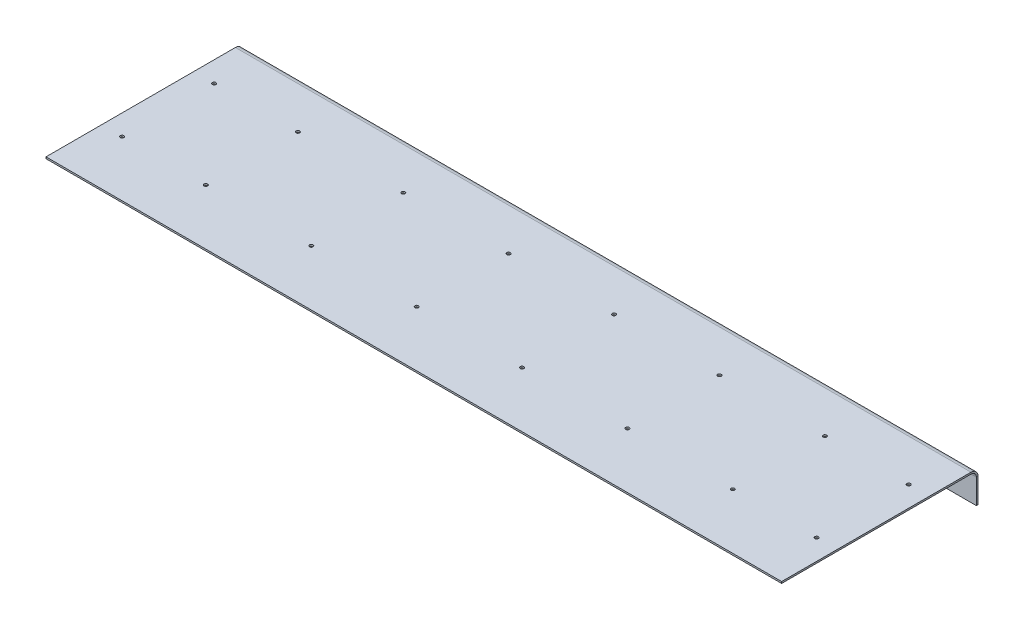
ISO-10303-21;
HEADER;
FILE_DESCRIPTION(('STEP AP214'),'2;1');
FILE_NAME('part.step','',(''),(''),'','','');
FILE_SCHEMA(('AUTOMOTIVE_DESIGN { 1 0 10303 214 1 1 1 1 }'));
ENDSEC;
DATA;
#1=APPLICATION_CONTEXT('core data for automotive mechanical design processes');
#2=APPLICATION_PROTOCOL_DEFINITION('international standard','automotive_design',2000,#1);
#3=PRODUCT_CONTEXT('',#1,'mechanical');
#4=PRODUCT('Part','Part','',(#3));
#5=PRODUCT_RELATED_PRODUCT_CATEGORY('part','',(#4));
#6=PRODUCT_DEFINITION_FORMATION('','',#4);
#7=PRODUCT_DEFINITION_CONTEXT('part definition',#1,'design');
#8=PRODUCT_DEFINITION('design','',#6,#7);
#9=PRODUCT_DEFINITION_SHAPE('','',#8);
#10=(LENGTH_UNIT() NAMED_UNIT(*) SI_UNIT(.MILLI.,.METRE.));
#11=(NAMED_UNIT(*) PLANE_ANGLE_UNIT() SI_UNIT($,.RADIAN.));
#12=(NAMED_UNIT(*) SI_UNIT($,.STERADIAN.) SOLID_ANGLE_UNIT());
#13=UNCERTAINTY_MEASURE_WITH_UNIT(LENGTH_MEASURE(1.E-05),#10,'distance_accuracy_value','');
#14=(GEOMETRIC_REPRESENTATION_CONTEXT(3) GLOBAL_UNCERTAINTY_ASSIGNED_CONTEXT((#13)) GLOBAL_UNIT_ASSIGNED_CONTEXT((#10,
#11,#12)) REPRESENTATION_CONTEXT('',''));
#15=CARTESIAN_POINT('',(0.,0.,0.));
#16=DIRECTION('',(0.,0.,1.));
#17=DIRECTION('',(1.,0.,0.));
#18=AXIS2_PLACEMENT_3D('',#15,#16,#17);
#19=CARTESIAN_POINT('',(686.2194092827,-3.175,-428.518987341772));
#20=DIRECTION('',(1.,0.,0.));
#21=DIRECTION('',(0.,0.,-1.));
#22=AXIS2_PLACEMENT_3D('',#19,#20,#21);
#23=PLANE('',#22);
#24=DIRECTION('',(0.,-1.,0.));
#25=VECTOR('',#24,1.);
#26=CARTESIAN_POINT('',(686.2194092827,6.825,-55.8789873417722));
#27=LINE('',#26,#25);
#28=CARTESIAN_POINT('',(686.2194092827,0.,-55.8789873417722));
#29=VERTEX_POINT('',#28);
#30=CARTESIAN_POINT('',(686.2194092827,-3.175,-55.8789873417722));
#31=VERTEX_POINT('',#30);
#32=EDGE_CURVE('E133',#29,#31,#27,.T.);
#33=ORIENTED_EDGE('',*,*,#32,.T.);
#34=DIRECTION('',(0.,0.,-1.));
#35=VECTOR('',#34,1.);
#36=CARTESIAN_POINT('',(686.2194092827,-3.175,-428.518987341772));
#37=LINE('',#36,#35);
#38=CARTESIAN_POINT('',(686.2194092827,-3.175,-415.343987341772));
#39=VERTEX_POINT('',#38);
#40=EDGE_CURVE('E13',#31,#39,#37,.T.);
#41=ORIENTED_EDGE('',*,*,#40,.T.);
#42=DIRECTION('',(0.,1.,0.));
#43=VECTOR('',#42,1.);
#44=CARTESIAN_POINT('',(686.2194092827,-3.175,-415.343987341772));
#45=LINE('',#44,#43);
#46=CARTESIAN_POINT('',(686.2194092827,0.,-415.343987341772));
#47=VERTEX_POINT('',#46);
#48=EDGE_CURVE('E248',#39,#47,#45,.T.);
#49=ORIENTED_EDGE('',*,*,#48,.T.);
#50=DIRECTION('',(0.,0.,-1.));
#51=VECTOR('',#50,1.);
#52=CARTESIAN_POINT('',(686.2194092827,0.,-428.518987341772));
#53=LINE('',#52,#51);
#54=EDGE_CURVE('E64',#29,#47,#53,.T.);
#55=ORIENTED_EDGE('',*,*,#54,.F.);
#56=EDGE_LOOP('',(#33,#41,#49,#55));
#57=FACE_BOUND('',#56,.T.);
#58=ADVANCED_FACE('F60',(#57),#23,.T.);
#59=CARTESIAN_POINT('',(0.,-3.175,0.));
#60=DIRECTION('',(0.,1.,0.));
#61=DIRECTION('',(0.,0.,1.));
#62=AXIS2_PLACEMENT_3D('',#59,#60,#61);
#63=PLANE('',#62);
#64=CARTESIAN_POINT('',(647.219409282701,-3.175,-335.878987341764));
#65=DIRECTION('',(0.,-1.,0.));
#66=DIRECTION('',(0.,0.,-1.));
#67=AXIS2_PLACEMENT_3D('',#64,#65,#66);
#68=CIRCLE('',#67,3.3782);
#69=CARTESIAN_POINT('',(647.219409282701,-3.175,-339.257187341764));
#70=VERTEX_POINT('',#69);
#71=EDGE_CURVE('E151',#70,#70,#68,.T.);
#72=ORIENTED_EDGE('',*,*,#71,.F.);
#73=EDGE_LOOP('',(#72));
#74=FACE_BOUND('',#73,.T.);
#75=CARTESIAN_POINT('',(647.219409282701,-3.175,-161.278987341764));
#76=DIRECTION('',(0.,-1.,0.));
#77=DIRECTION('',(0.,0.,-1.));
#78=AXIS2_PLACEMENT_3D('',#75,#76,#77);
#79=CIRCLE('',#78,3.3782);
#80=CARTESIAN_POINT('',(647.219409282701,-3.175,-164.657187341764));
#81=VERTEX_POINT('',#80);
#82=EDGE_CURVE('E159',#81,#81,#79,.T.);
#83=ORIENTED_EDGE('',*,*,#82,.F.);
#84=EDGE_LOOP('',(#83));
#85=FACE_BOUND('',#84,.T.);
#86=CARTESIAN_POINT('',(-670.7805907173,-3.175,-335.878987341772));
#87=DIRECTION('',(0.,-1.,0.));
#88=DIRECTION('',(0.,0.,-1.));
#89=AXIS2_PLACEMENT_3D('',#86,#87,#88);
#90=CIRCLE('',#89,3.3782);
#91=CARTESIAN_POINT('',(-670.7805907173,-3.175,-339.257187341772));
#92=VERTEX_POINT('',#91);
#93=EDGE_CURVE('E167',#92,#92,#90,.T.);
#94=ORIENTED_EDGE('',*,*,#93,.F.);
#95=EDGE_LOOP('',(#94));
#96=FACE_BOUND('',#95,.T.);
#97=CARTESIAN_POINT('',(-670.7805907173,-3.175,-161.278987341772));
#98=DIRECTION('',(0.,-1.,0.));
#99=DIRECTION('',(0.,0.,-1.));
#100=AXIS2_PLACEMENT_3D('',#97,#98,#99);
#101=CIRCLE('',#100,3.3782);
#102=CARTESIAN_POINT('',(-670.7805907173,-3.175,-164.657187341772));
#103=VERTEX_POINT('',#102);
#104=EDGE_CURVE('E173',#103,#103,#101,.T.);
#105=ORIENTED_EDGE('',*,*,#104,.F.);
#106=EDGE_LOOP('',(#105));
#107=FACE_BOUND('',#106,.T.);
#108=CARTESIAN_POINT('',(488.2194092827,-3.175,-335.878987341765));
#109=DIRECTION('',(0.,-1.,0.));
#110=DIRECTION('',(0.,0.,-1.));
#111=AXIS2_PLACEMENT_3D('',#108,#109,#110);
#112=CIRCLE('',#111,3.3782);
#113=CARTESIAN_POINT('',(488.2194092827,-3.175,-339.257187341765));
#114=VERTEX_POINT('',#113);
#115=EDGE_CURVE('E179',#114,#114,#112,.T.);
#116=ORIENTED_EDGE('',*,*,#115,.F.);
#117=EDGE_LOOP('',(#116));
#118=FACE_BOUND('',#117,.T.);
#119=CARTESIAN_POINT('',(488.2194092827,-3.175,-161.278987341765));
#120=DIRECTION('',(0.,-1.,0.));
#121=DIRECTION('',(0.,0.,-1.));
#122=AXIS2_PLACEMENT_3D('',#119,#120,#121);
#123=CIRCLE('',#122,3.3782);
#124=CARTESIAN_POINT('',(488.2194092827,-3.175,-164.657187341765));
#125=VERTEX_POINT('',#124);
#126=EDGE_CURVE('E185',#125,#125,#123,.T.);
#127=ORIENTED_EDGE('',*,*,#126,.F.);
#128=EDGE_LOOP('',(#127));
#129=FACE_BOUND('',#128,.T.);
#130=CARTESIAN_POINT('',(288.2194092827,-3.175,-335.878987341767));
#131=DIRECTION('',(0.,-1.,0.));
#132=DIRECTION('',(0.,0.,-1.));
#133=AXIS2_PLACEMENT_3D('',#130,#131,#132);
#134=CIRCLE('',#133,3.3782);
#135=CARTESIAN_POINT('',(288.2194092827,-3.175,-339.257187341767));
#136=VERTEX_POINT('',#135);
#137=EDGE_CURVE('E191',#136,#136,#134,.T.);
#138=ORIENTED_EDGE('',*,*,#137,.F.);
#139=EDGE_LOOP('',(#138));
#140=FACE_BOUND('',#139,.T.);
#141=CARTESIAN_POINT('',(288.2194092827,-3.175,-161.278987341767));
#142=DIRECTION('',(0.,-1.,0.));
#143=DIRECTION('',(0.,0.,-1.));
#144=AXIS2_PLACEMENT_3D('',#141,#142,#143);
#145=CIRCLE('',#144,3.3782);
#146=CARTESIAN_POINT('',(288.2194092827,-3.175,-164.657187341767));
#147=VERTEX_POINT('',#146);
#148=EDGE_CURVE('E197',#147,#147,#145,.T.);
#149=ORIENTED_EDGE('',*,*,#148,.F.);
#150=EDGE_LOOP('',(#149));
#151=FACE_BOUND('',#150,.T.);
#152=CARTESIAN_POINT('',(88.2194092827006,-3.175,-335.878987341768));
#153=DIRECTION('',(0.,-1.,0.));
#154=DIRECTION('',(0.,0.,-1.));
#155=AXIS2_PLACEMENT_3D('',#152,#153,#154);
#156=CIRCLE('',#155,3.3782);
#157=CARTESIAN_POINT('',(88.2194092827006,-3.175,-339.257187341768));
#158=VERTEX_POINT('',#157);
#159=EDGE_CURVE('E203',#158,#158,#156,.T.);
#160=ORIENTED_EDGE('',*,*,#159,.F.);
#161=EDGE_LOOP('',(#160));
#162=FACE_BOUND('',#161,.T.);
#163=CARTESIAN_POINT('',(88.2194092827006,-3.175,-161.278987341768));
#164=DIRECTION('',(0.,-1.,0.));
#165=DIRECTION('',(0.,0.,-1.));
#166=AXIS2_PLACEMENT_3D('',#163,#164,#165);
#167=CIRCLE('',#166,3.3782);
#168=CARTESIAN_POINT('',(88.2194092827006,-3.175,-164.657187341768));
#169=VERTEX_POINT('',#168);
#170=EDGE_CURVE('E209',#169,#169,#167,.T.);
#171=ORIENTED_EDGE('',*,*,#170,.F.);
#172=EDGE_LOOP('',(#171));
#173=FACE_BOUND('',#172,.T.);
#174=CARTESIAN_POINT('',(-111.7805907173,-3.175,-335.87898734177));
#175=DIRECTION('',(0.,-1.,0.));
#176=DIRECTION('',(0.,0.,-1.));
#177=AXIS2_PLACEMENT_3D('',#174,#175,#176);
#178=CIRCLE('',#177,3.3782);
#179=CARTESIAN_POINT('',(-111.7805907173,-3.175,-339.25718734177));
#180=VERTEX_POINT('',#179);
#181=EDGE_CURVE('E215',#180,#180,#178,.T.);
#182=ORIENTED_EDGE('',*,*,#181,.F.);
#183=EDGE_LOOP('',(#182));
#184=FACE_BOUND('',#183,.T.);
#185=CARTESIAN_POINT('',(-111.7805907173,-3.175,-161.27898734177));
#186=DIRECTION('',(0.,-1.,0.));
#187=DIRECTION('',(0.,0.,-1.));
#188=AXIS2_PLACEMENT_3D('',#185,#186,#187);
#189=CIRCLE('',#188,3.3782);
#190=CARTESIAN_POINT('',(-111.7805907173,-3.175,-164.65718734177));
#191=VERTEX_POINT('',#190);
#192=EDGE_CURVE('E221',#191,#191,#189,.T.);
#193=ORIENTED_EDGE('',*,*,#192,.F.);
#194=EDGE_LOOP('',(#193));
#195=FACE_BOUND('',#194,.T.);
#196=CARTESIAN_POINT('',(-311.7805907173,-3.175,-335.878987341771));
#197=DIRECTION('',(0.,-1.,0.));
#198=DIRECTION('',(0.,0.,-1.));
#199=AXIS2_PLACEMENT_3D('',#196,#197,#198);
#200=CIRCLE('',#199,3.3782);
#201=CARTESIAN_POINT('',(-311.7805907173,-3.175,-339.257187341771));
#202=VERTEX_POINT('',#201);
#203=EDGE_CURVE('E227',#202,#202,#200,.T.);
#204=ORIENTED_EDGE('',*,*,#203,.F.);
#205=EDGE_LOOP('',(#204));
#206=FACE_BOUND('',#205,.T.);
#207=CARTESIAN_POINT('',(-311.7805907173,-3.175,-161.278987341771));
#208=DIRECTION('',(0.,-1.,0.));
#209=DIRECTION('',(0.,0.,-1.));
#210=AXIS2_PLACEMENT_3D('',#207,#208,#209);
#211=CIRCLE('',#210,3.3782);
#212=CARTESIAN_POINT('',(-311.7805907173,-3.175,-164.657187341771));
#213=VERTEX_POINT('',#212);
#214=EDGE_CURVE('E233',#213,#213,#211,.T.);
#215=ORIENTED_EDGE('',*,*,#214,.F.);
#216=EDGE_LOOP('',(#215));
#217=FACE_BOUND('',#216,.T.);
#218=CARTESIAN_POINT('',(-511.7805907173,-3.175,-335.878987341772));
#219=DIRECTION('',(0.,-1.,0.));
#220=DIRECTION('',(0.,0.,-1.));
#221=AXIS2_PLACEMENT_3D('',#218,#219,#220);
#222=CIRCLE('',#221,3.3782);
#223=CARTESIAN_POINT('',(-511.7805907173,-3.175,-339.257187341772));
#224=VERTEX_POINT('',#223);
#225=EDGE_CURVE('E239',#224,#224,#222,.T.);
#226=ORIENTED_EDGE('',*,*,#225,.F.);
#227=EDGE_LOOP('',(#226));
#228=FACE_BOUND('',#227,.T.);
#229=CARTESIAN_POINT('',(-511.7805907173,-3.175,-161.278987341772));
#230=DIRECTION('',(0.,-1.,0.));
#231=DIRECTION('',(0.,0.,-1.));
#232=AXIS2_PLACEMENT_3D('',#229,#230,#231);
#233=CIRCLE('',#232,3.3782);
#234=CARTESIAN_POINT('',(-511.7805907173,-3.175,-164.657187341772));
#235=VERTEX_POINT('',#234);
#236=EDGE_CURVE('E245',#235,#235,#233,.T.);
#237=ORIENTED_EDGE('',*,*,#236,.F.);
#238=EDGE_LOOP('',(#237));
#239=FACE_BOUND('',#238,.T.);
#240=ORIENTED_EDGE('',*,*,#40,.F.);
#241=DIRECTION('',(1.,0.,0.));
#242=VECTOR('',#241,1.);
#243=CARTESIAN_POINT('',(-709.7805907173,-3.175,-55.8789873417724));
#244=LINE('',#243,#242);
#245=CARTESIAN_POINT('',(-709.7805907173,-3.175,-55.8789873417724));
#246=VERTEX_POINT('',#245);
#247=EDGE_CURVE('E127',#246,#31,#244,.T.);
#248=ORIENTED_EDGE('',*,*,#247,.F.);
#249=DIRECTION('',(0.,0.,1.));
#250=VECTOR('',#249,1.);
#251=CARTESIAN_POINT('',(-709.7805907173,-3.175,-428.518987341772));
#252=LINE('',#251,#250);
#253=CARTESIAN_POINT('',(-709.7805907173,-3.175,-415.343987341772));
#254=VERTEX_POINT('',#253);
#255=EDGE_CURVE('E69',#254,#246,#252,.T.);
#256=ORIENTED_EDGE('',*,*,#255,.F.);
#257=DIRECTION('',(1.,0.,0.));
#258=VECTOR('',#257,1.);
#259=CARTESIAN_POINT('',(686.2194092827,-3.175,-415.343987341772));
#260=LINE('',#259,#258);
#261=EDGE_CURVE('E255',#39,#254,#260,.F.);
#262=ORIENTED_EDGE('',*,*,#261,.F.);
#263=EDGE_LOOP('',(#240,#248,#256,#262));
#264=FACE_BOUND('',#263,.T.);
#265=ADVANCED_FACE('F138',(#74,#85,#96,#107,#118,#129,#140,#151,#162,#173,#184,#195,#206,#217,
#228,#239,#264),#63,.F.);
#266=CARTESIAN_POINT('',(0.,0.,0.));
#267=DIRECTION('',(0.,1.,0.));
#268=DIRECTION('',(0.,0.,1.));
#269=AXIS2_PLACEMENT_3D('',#266,#267,#268);
#270=PLANE('',#269);
#271=DIRECTION('',(-1.,0.,0.));
#272=VECTOR('',#271,1.);
#273=CARTESIAN_POINT('',(0.,0.,-55.8789873417723));
#274=LINE('',#273,#272);
#275=CARTESIAN_POINT('',(-709.7805907173,0.,-55.8789873417725));
#276=VERTEX_POINT('',#275);
#277=EDGE_CURVE('E77',#29,#276,#274,.T.);
#278=ORIENTED_EDGE('',*,*,#277,.F.);
#279=ORIENTED_EDGE('',*,*,#54,.T.);
#280=DIRECTION('',(1.,0.,0.));
#281=VECTOR('',#280,1.);
#282=CARTESIAN_POINT('',(686.2194092827,0.,-415.343987341772));
#283=LINE('',#282,#281);
#284=CARTESIAN_POINT('',(-709.7805907173,0.,-415.343987341772));
#285=VERTEX_POINT('',#284);
#286=EDGE_CURVE('E264',#47,#285,#283,.F.);
#287=ORIENTED_EDGE('',*,*,#286,.T.);
#288=DIRECTION('',(0.,0.,1.));
#289=VECTOR('',#288,1.);
#290=CARTESIAN_POINT('',(-709.7805907173,0.,-428.518987341772));
#291=LINE('',#290,#289);
#292=EDGE_CURVE('E144',#285,#276,#291,.T.);
#293=ORIENTED_EDGE('',*,*,#292,.T.);
#294=EDGE_LOOP('',(#278,#279,#287,#293));
#295=FACE_BOUND('',#294,.T.);
#296=CARTESIAN_POINT('',(-511.7805907173,0.,-161.278987341772));
#297=DIRECTION('',(0.,-1.,0.));
#298=DIRECTION('',(0.,0.,-1.));
#299=AXIS2_PLACEMENT_3D('',#296,#297,#298);
#300=CIRCLE('',#299,3.3782);
#301=CARTESIAN_POINT('',(-511.7805907173,0.,-164.657187341772));
#302=VERTEX_POINT('',#301);
#303=EDGE_CURVE('E242',#302,#302,#300,.T.);
#304=ORIENTED_EDGE('',*,*,#303,.T.);
#305=EDGE_LOOP('',(#304));
#306=FACE_BOUND('',#305,.T.);
#307=CARTESIAN_POINT('',(-511.7805907173,0.,-335.878987341772));
#308=DIRECTION('',(0.,-1.,0.));
#309=DIRECTION('',(0.,0.,-1.));
#310=AXIS2_PLACEMENT_3D('',#307,#308,#309);
#311=CIRCLE('',#310,3.3782);
#312=CARTESIAN_POINT('',(-511.7805907173,0.,-339.257187341772));
#313=VERTEX_POINT('',#312);
#314=EDGE_CURVE('E236',#313,#313,#311,.T.);
#315=ORIENTED_EDGE('',*,*,#314,.T.);
#316=EDGE_LOOP('',(#315));
#317=FACE_BOUND('',#316,.T.);
#318=CARTESIAN_POINT('',(-311.7805907173,0.,-161.278987341771));
#319=DIRECTION('',(0.,-1.,0.));
#320=DIRECTION('',(0.,0.,-1.));
#321=AXIS2_PLACEMENT_3D('',#318,#319,#320);
#322=CIRCLE('',#321,3.3782);
#323=CARTESIAN_POINT('',(-311.7805907173,0.,-164.657187341771));
#324=VERTEX_POINT('',#323);
#325=EDGE_CURVE('E230',#324,#324,#322,.T.);
#326=ORIENTED_EDGE('',*,*,#325,.T.);
#327=EDGE_LOOP('',(#326));
#328=FACE_BOUND('',#327,.T.);
#329=CARTESIAN_POINT('',(-311.7805907173,0.,-335.878987341771));
#330=DIRECTION('',(0.,-1.,0.));
#331=DIRECTION('',(0.,0.,-1.));
#332=AXIS2_PLACEMENT_3D('',#329,#330,#331);
#333=CIRCLE('',#332,3.3782);
#334=CARTESIAN_POINT('',(-311.7805907173,0.,-339.257187341771));
#335=VERTEX_POINT('',#334);
#336=EDGE_CURVE('E224',#335,#335,#333,.T.);
#337=ORIENTED_EDGE('',*,*,#336,.T.);
#338=EDGE_LOOP('',(#337));
#339=FACE_BOUND('',#338,.T.);
#340=CARTESIAN_POINT('',(-111.7805907173,0.,-161.27898734177));
#341=DIRECTION('',(0.,-1.,0.));
#342=DIRECTION('',(0.,0.,-1.));
#343=AXIS2_PLACEMENT_3D('',#340,#341,#342);
#344=CIRCLE('',#343,3.3782);
#345=CARTESIAN_POINT('',(-111.7805907173,0.,-164.65718734177));
#346=VERTEX_POINT('',#345);
#347=EDGE_CURVE('E218',#346,#346,#344,.T.);
#348=ORIENTED_EDGE('',*,*,#347,.T.);
#349=EDGE_LOOP('',(#348));
#350=FACE_BOUND('',#349,.T.);
#351=CARTESIAN_POINT('',(-111.7805907173,0.,-335.87898734177));
#352=DIRECTION('',(0.,-1.,0.));
#353=DIRECTION('',(0.,0.,-1.));
#354=AXIS2_PLACEMENT_3D('',#351,#352,#353);
#355=CIRCLE('',#354,3.3782);
#356=CARTESIAN_POINT('',(-111.7805907173,0.,-339.25718734177));
#357=VERTEX_POINT('',#356);
#358=EDGE_CURVE('E212',#357,#357,#355,.T.);
#359=ORIENTED_EDGE('',*,*,#358,.T.);
#360=EDGE_LOOP('',(#359));
#361=FACE_BOUND('',#360,.T.);
#362=CARTESIAN_POINT('',(88.2194092827006,0.,-161.278987341768));
#363=DIRECTION('',(0.,-1.,0.));
#364=DIRECTION('',(0.,0.,-1.));
#365=AXIS2_PLACEMENT_3D('',#362,#363,#364);
#366=CIRCLE('',#365,3.3782);
#367=CARTESIAN_POINT('',(88.2194092827006,0.,-164.657187341768));
#368=VERTEX_POINT('',#367);
#369=EDGE_CURVE('E206',#368,#368,#366,.T.);
#370=ORIENTED_EDGE('',*,*,#369,.T.);
#371=EDGE_LOOP('',(#370));
#372=FACE_BOUND('',#371,.T.);
#373=CARTESIAN_POINT('',(88.2194092827006,0.,-335.878987341768));
#374=DIRECTION('',(0.,-1.,0.));
#375=DIRECTION('',(0.,0.,-1.));
#376=AXIS2_PLACEMENT_3D('',#373,#374,#375);
#377=CIRCLE('',#376,3.3782);
#378=CARTESIAN_POINT('',(88.2194092827006,0.,-339.257187341768));
#379=VERTEX_POINT('',#378);
#380=EDGE_CURVE('E200',#379,#379,#377,.T.);
#381=ORIENTED_EDGE('',*,*,#380,.T.);
#382=EDGE_LOOP('',(#381));
#383=FACE_BOUND('',#382,.T.);
#384=CARTESIAN_POINT('',(288.2194092827,0.,-161.278987341767));
#385=DIRECTION('',(0.,-1.,0.));
#386=DIRECTION('',(0.,0.,-1.));
#387=AXIS2_PLACEMENT_3D('',#384,#385,#386);
#388=CIRCLE('',#387,3.3782);
#389=CARTESIAN_POINT('',(288.2194092827,0.,-164.657187341767));
#390=VERTEX_POINT('',#389);
#391=EDGE_CURVE('E194',#390,#390,#388,.T.);
#392=ORIENTED_EDGE('',*,*,#391,.T.);
#393=EDGE_LOOP('',(#392));
#394=FACE_BOUND('',#393,.T.);
#395=CARTESIAN_POINT('',(288.2194092827,0.,-335.878987341767));
#396=DIRECTION('',(0.,-1.,0.));
#397=DIRECTION('',(0.,0.,-1.));
#398=AXIS2_PLACEMENT_3D('',#395,#396,#397);
#399=CIRCLE('',#398,3.3782);
#400=CARTESIAN_POINT('',(288.2194092827,0.,-339.257187341767));
#401=VERTEX_POINT('',#400);
#402=EDGE_CURVE('E188',#401,#401,#399,.T.);
#403=ORIENTED_EDGE('',*,*,#402,.T.);
#404=EDGE_LOOP('',(#403));
#405=FACE_BOUND('',#404,.T.);
#406=CARTESIAN_POINT('',(488.2194092827,0.,-161.278987341765));
#407=DIRECTION('',(0.,-1.,0.));
#408=DIRECTION('',(0.,0.,-1.));
#409=AXIS2_PLACEMENT_3D('',#406,#407,#408);
#410=CIRCLE('',#409,3.3782);
#411=CARTESIAN_POINT('',(488.2194092827,0.,-164.657187341765));
#412=VERTEX_POINT('',#411);
#413=EDGE_CURVE('E182',#412,#412,#410,.T.);
#414=ORIENTED_EDGE('',*,*,#413,.T.);
#415=EDGE_LOOP('',(#414));
#416=FACE_BOUND('',#415,.T.);
#417=CARTESIAN_POINT('',(488.2194092827,0.,-335.878987341765));
#418=DIRECTION('',(0.,-1.,0.));
#419=DIRECTION('',(0.,0.,-1.));
#420=AXIS2_PLACEMENT_3D('',#417,#418,#419);
#421=CIRCLE('',#420,3.3782);
#422=CARTESIAN_POINT('',(488.2194092827,0.,-339.257187341765));
#423=VERTEX_POINT('',#422);
#424=EDGE_CURVE('E176',#423,#423,#421,.T.);
#425=ORIENTED_EDGE('',*,*,#424,.T.);
#426=EDGE_LOOP('',(#425));
#427=FACE_BOUND('',#426,.T.);
#428=CARTESIAN_POINT('',(-670.7805907173,0.,-161.278987341772));
#429=DIRECTION('',(0.,-1.,0.));
#430=DIRECTION('',(0.,0.,-1.));
#431=AXIS2_PLACEMENT_3D('',#428,#429,#430);
#432=CIRCLE('',#431,3.3782);
#433=CARTESIAN_POINT('',(-670.7805907173,0.,-164.657187341772));
#434=VERTEX_POINT('',#433);
#435=EDGE_CURVE('E170',#434,#434,#432,.T.);
#436=ORIENTED_EDGE('',*,*,#435,.T.);
#437=EDGE_LOOP('',(#436));
#438=FACE_BOUND('',#437,.T.);
#439=CARTESIAN_POINT('',(-670.7805907173,0.,-335.878987341772));
#440=DIRECTION('',(0.,-1.,0.));
#441=DIRECTION('',(0.,0.,-1.));
#442=AXIS2_PLACEMENT_3D('',#439,#440,#441);
#443=CIRCLE('',#442,3.3782);
#444=CARTESIAN_POINT('',(-670.7805907173,0.,-339.257187341772));
#445=VERTEX_POINT('',#444);
#446=EDGE_CURVE('E164',#445,#445,#443,.T.);
#447=ORIENTED_EDGE('',*,*,#446,.T.);
#448=EDGE_LOOP('',(#447));
#449=FACE_BOUND('',#448,.T.);
#450=CARTESIAN_POINT('',(647.219409282701,0.,-161.278987341764));
#451=DIRECTION('',(0.,-1.,0.));
#452=DIRECTION('',(0.,0.,-1.));
#453=AXIS2_PLACEMENT_3D('',#450,#451,#452);
#454=CIRCLE('',#453,3.3782);
#455=CARTESIAN_POINT('',(647.219409282701,0.,-164.657187341764));
#456=VERTEX_POINT('',#455);
#457=EDGE_CURVE('E155',#456,#456,#454,.T.);
#458=ORIENTED_EDGE('',*,*,#457,.T.);
#459=EDGE_LOOP('',(#458));
#460=FACE_BOUND('',#459,.T.);
#461=CARTESIAN_POINT('',(647.219409282701,0.,-335.878987341764));
#462=DIRECTION('',(0.,-1.,0.));
#463=DIRECTION('',(0.,0.,-1.));
#464=AXIS2_PLACEMENT_3D('',#461,#462,#463);
#465=CIRCLE('',#464,3.3782);
#466=CARTESIAN_POINT('',(647.219409282701,0.,-339.257187341764));
#467=VERTEX_POINT('',#466);
#468=EDGE_CURVE('E146',#467,#467,#465,.T.);
#469=ORIENTED_EDGE('',*,*,#468,.T.);
#470=EDGE_LOOP('',(#469));
#471=FACE_BOUND('',#470,.T.);
#472=ADVANCED_FACE('F336',(#295,#306,#317,#328,#339,#350,#361,#372,#383,#394,#405,#416,#427,
#438,#449,#460,#471),#270,.T.);
#473=CARTESIAN_POINT('',(-709.7805907173,-3.175,-428.518987341772));
#474=DIRECTION('',(-1.,0.,0.));
#475=DIRECTION('',(0.,0.,1.));
#476=AXIS2_PLACEMENT_3D('',#473,#474,#475);
#477=PLANE('',#476);
#478=DIRECTION('',(0.,-1.,0.));
#479=VECTOR('',#478,1.);
#480=CARTESIAN_POINT('',(-709.7805907173,6.825,-55.8789873417724));
#481=LINE('',#480,#479);
#482=EDGE_CURVE('E124',#276,#246,#481,.T.);
#483=ORIENTED_EDGE('',*,*,#482,.F.);
#484=ORIENTED_EDGE('',*,*,#292,.F.);
#485=DIRECTION('',(0.,1.,0.));
#486=VECTOR('',#485,1.);
#487=CARTESIAN_POINT('',(-709.7805907173,-3.175,-415.343987341772));
#488=LINE('',#487,#486);
#489=EDGE_CURVE('E142',#254,#285,#488,.T.);
#490=ORIENTED_EDGE('',*,*,#489,.F.);
#491=ORIENTED_EDGE('',*,*,#255,.T.);
#492=EDGE_LOOP('',(#483,#484,#490,#491));
#493=FACE_BOUND('',#492,.T.);
#494=ADVANCED_FACE('F62',(#493),#477,.T.);
#495=CARTESIAN_POINT('',(647.219409282701,-3.175,-335.878987341764));
#496=DIRECTION('',(0.,-1.,0.));
#497=DIRECTION('',(0.,0.,-1.));
#498=AXIS2_PLACEMENT_3D('',#495,#496,#497);
#499=CYLINDRICAL_SURFACE('',#498,3.3782);
#500=ORIENTED_EDGE('',*,*,#468,.F.);
#501=EDGE_LOOP('',(#500));
#502=FACE_BOUND('',#501,.T.);
#503=ORIENTED_EDGE('',*,*,#71,.T.);
#504=EDGE_LOOP('',(#503));
#505=FACE_BOUND('',#504,.T.);
#506=ADVANCED_FACE('F391',(#502,#505),#499,.F.);
#507=CARTESIAN_POINT('',(647.219409282701,-3.175,-161.278987341764));
#508=DIRECTION('',(0.,-1.,0.));
#509=DIRECTION('',(0.,0.,-1.));
#510=AXIS2_PLACEMENT_3D('',#507,#508,#509);
#511=CYLINDRICAL_SURFACE('',#510,3.3782);
#512=ORIENTED_EDGE('',*,*,#457,.F.);
#513=EDGE_LOOP('',(#512));
#514=FACE_BOUND('',#513,.T.);
#515=ORIENTED_EDGE('',*,*,#82,.T.);
#516=EDGE_LOOP('',(#515));
#517=FACE_BOUND('',#516,.T.);
#518=ADVANCED_FACE('F394',(#514,#517),#511,.F.);
#519=CARTESIAN_POINT('',(-670.7805907173,-3.175,-335.878987341772));
#520=DIRECTION('',(0.,-1.,0.));
#521=DIRECTION('',(0.,0.,-1.));
#522=AXIS2_PLACEMENT_3D('',#519,#520,#521);
#523=CYLINDRICAL_SURFACE('',#522,3.3782);
#524=ORIENTED_EDGE('',*,*,#446,.F.);
#525=EDGE_LOOP('',(#524));
#526=FACE_BOUND('',#525,.T.);
#527=ORIENTED_EDGE('',*,*,#93,.T.);
#528=EDGE_LOOP('',(#527));
#529=FACE_BOUND('',#528,.T.);
#530=ADVANCED_FACE('F398',(#526,#529),#523,.F.);
#531=CARTESIAN_POINT('',(-670.7805907173,-3.175,-161.278987341772));
#532=DIRECTION('',(0.,-1.,0.));
#533=DIRECTION('',(0.,0.,-1.));
#534=AXIS2_PLACEMENT_3D('',#531,#532,#533);
#535=CYLINDRICAL_SURFACE('',#534,3.3782);
#536=ORIENTED_EDGE('',*,*,#435,.F.);
#537=EDGE_LOOP('',(#536));
#538=FACE_BOUND('',#537,.T.);
#539=ORIENTED_EDGE('',*,*,#104,.T.);
#540=EDGE_LOOP('',(#539));
#541=FACE_BOUND('',#540,.T.);
#542=ADVANCED_FACE('F402',(#538,#541),#535,.F.);
#543=CARTESIAN_POINT('',(488.2194092827,-3.175,-335.878987341765));
#544=DIRECTION('',(0.,-1.,0.));
#545=DIRECTION('',(0.,0.,-1.));
#546=AXIS2_PLACEMENT_3D('',#543,#544,#545);
#547=CYLINDRICAL_SURFACE('',#546,3.3782);
#548=ORIENTED_EDGE('',*,*,#424,.F.);
#549=EDGE_LOOP('',(#548));
#550=FACE_BOUND('',#549,.T.);
#551=ORIENTED_EDGE('',*,*,#115,.T.);
#552=EDGE_LOOP('',(#551));
#553=FACE_BOUND('',#552,.T.);
#554=ADVANCED_FACE('F406',(#550,#553),#547,.F.);
#555=CARTESIAN_POINT('',(488.2194092827,-3.175,-161.278987341765));
#556=DIRECTION('',(0.,-1.,0.));
#557=DIRECTION('',(0.,0.,-1.));
#558=AXIS2_PLACEMENT_3D('',#555,#556,#557);
#559=CYLINDRICAL_SURFACE('',#558,3.3782);
#560=ORIENTED_EDGE('',*,*,#413,.F.);
#561=EDGE_LOOP('',(#560));
#562=FACE_BOUND('',#561,.T.);
#563=ORIENTED_EDGE('',*,*,#126,.T.);
#564=EDGE_LOOP('',(#563));
#565=FACE_BOUND('',#564,.T.);
#566=ADVANCED_FACE('F410',(#562,#565),#559,.F.);
#567=CARTESIAN_POINT('',(288.2194092827,-3.175,-335.878987341767));
#568=DIRECTION('',(0.,-1.,0.));
#569=DIRECTION('',(0.,0.,-1.));
#570=AXIS2_PLACEMENT_3D('',#567,#568,#569);
#571=CYLINDRICAL_SURFACE('',#570,3.3782);
#572=ORIENTED_EDGE('',*,*,#402,.F.);
#573=EDGE_LOOP('',(#572));
#574=FACE_BOUND('',#573,.T.);
#575=ORIENTED_EDGE('',*,*,#137,.T.);
#576=EDGE_LOOP('',(#575));
#577=FACE_BOUND('',#576,.T.);
#578=ADVANCED_FACE('F414',(#574,#577),#571,.F.);
#579=CARTESIAN_POINT('',(288.2194092827,-3.175,-161.278987341767));
#580=DIRECTION('',(0.,-1.,0.));
#581=DIRECTION('',(0.,0.,-1.));
#582=AXIS2_PLACEMENT_3D('',#579,#580,#581);
#583=CYLINDRICAL_SURFACE('',#582,3.3782);
#584=ORIENTED_EDGE('',*,*,#391,.F.);
#585=EDGE_LOOP('',(#584));
#586=FACE_BOUND('',#585,.T.);
#587=ORIENTED_EDGE('',*,*,#148,.T.);
#588=EDGE_LOOP('',(#587));
#589=FACE_BOUND('',#588,.T.);
#590=ADVANCED_FACE('F418',(#586,#589),#583,.F.);
#591=CARTESIAN_POINT('',(88.2194092827006,-3.175,-335.878987341768));
#592=DIRECTION('',(0.,-1.,0.));
#593=DIRECTION('',(0.,0.,-1.));
#594=AXIS2_PLACEMENT_3D('',#591,#592,#593);
#595=CYLINDRICAL_SURFACE('',#594,3.3782);
#596=ORIENTED_EDGE('',*,*,#380,.F.);
#597=EDGE_LOOP('',(#596));
#598=FACE_BOUND('',#597,.T.);
#599=ORIENTED_EDGE('',*,*,#159,.T.);
#600=EDGE_LOOP('',(#599));
#601=FACE_BOUND('',#600,.T.);
#602=ADVANCED_FACE('F422',(#598,#601),#595,.F.);
#603=CARTESIAN_POINT('',(88.2194092827006,-3.175,-161.278987341768));
#604=DIRECTION('',(0.,-1.,0.));
#605=DIRECTION('',(0.,0.,-1.));
#606=AXIS2_PLACEMENT_3D('',#603,#604,#605);
#607=CYLINDRICAL_SURFACE('',#606,3.3782);
#608=ORIENTED_EDGE('',*,*,#369,.F.);
#609=EDGE_LOOP('',(#608));
#610=FACE_BOUND('',#609,.T.);
#611=ORIENTED_EDGE('',*,*,#170,.T.);
#612=EDGE_LOOP('',(#611));
#613=FACE_BOUND('',#612,.T.);
#614=ADVANCED_FACE('F426',(#610,#613),#607,.F.);
#615=CARTESIAN_POINT('',(-111.7805907173,-3.175,-335.87898734177));
#616=DIRECTION('',(0.,-1.,0.));
#617=DIRECTION('',(0.,0.,-1.));
#618=AXIS2_PLACEMENT_3D('',#615,#616,#617);
#619=CYLINDRICAL_SURFACE('',#618,3.3782);
#620=ORIENTED_EDGE('',*,*,#358,.F.);
#621=EDGE_LOOP('',(#620));
#622=FACE_BOUND('',#621,.T.);
#623=ORIENTED_EDGE('',*,*,#181,.T.);
#624=EDGE_LOOP('',(#623));
#625=FACE_BOUND('',#624,.T.);
#626=ADVANCED_FACE('F430',(#622,#625),#619,.F.);
#627=CARTESIAN_POINT('',(-111.7805907173,-3.175,-161.27898734177));
#628=DIRECTION('',(0.,-1.,0.));
#629=DIRECTION('',(0.,0.,-1.));
#630=AXIS2_PLACEMENT_3D('',#627,#628,#629);
#631=CYLINDRICAL_SURFACE('',#630,3.3782);
#632=ORIENTED_EDGE('',*,*,#347,.F.);
#633=EDGE_LOOP('',(#632));
#634=FACE_BOUND('',#633,.T.);
#635=ORIENTED_EDGE('',*,*,#192,.T.);
#636=EDGE_LOOP('',(#635));
#637=FACE_BOUND('',#636,.T.);
#638=ADVANCED_FACE('F434',(#634,#637),#631,.F.);
#639=CARTESIAN_POINT('',(-311.7805907173,-3.175,-335.878987341771));
#640=DIRECTION('',(0.,-1.,0.));
#641=DIRECTION('',(0.,0.,-1.));
#642=AXIS2_PLACEMENT_3D('',#639,#640,#641);
#643=CYLINDRICAL_SURFACE('',#642,3.3782);
#644=ORIENTED_EDGE('',*,*,#336,.F.);
#645=EDGE_LOOP('',(#644));
#646=FACE_BOUND('',#645,.T.);
#647=ORIENTED_EDGE('',*,*,#203,.T.);
#648=EDGE_LOOP('',(#647));
#649=FACE_BOUND('',#648,.T.);
#650=ADVANCED_FACE('F438',(#646,#649),#643,.F.);
#651=CARTESIAN_POINT('',(-311.7805907173,-3.175,-161.278987341771));
#652=DIRECTION('',(0.,-1.,0.));
#653=DIRECTION('',(0.,0.,-1.));
#654=AXIS2_PLACEMENT_3D('',#651,#652,#653);
#655=CYLINDRICAL_SURFACE('',#654,3.3782);
#656=ORIENTED_EDGE('',*,*,#325,.F.);
#657=EDGE_LOOP('',(#656));
#658=FACE_BOUND('',#657,.T.);
#659=ORIENTED_EDGE('',*,*,#214,.T.);
#660=EDGE_LOOP('',(#659));
#661=FACE_BOUND('',#660,.T.);
#662=ADVANCED_FACE('F442',(#658,#661),#655,.F.);
#663=CARTESIAN_POINT('',(-511.7805907173,-3.175,-335.878987341772));
#664=DIRECTION('',(0.,-1.,0.));
#665=DIRECTION('',(0.,0.,-1.));
#666=AXIS2_PLACEMENT_3D('',#663,#664,#665);
#667=CYLINDRICAL_SURFACE('',#666,3.3782);
#668=ORIENTED_EDGE('',*,*,#314,.F.);
#669=EDGE_LOOP('',(#668));
#670=FACE_BOUND('',#669,.T.);
#671=ORIENTED_EDGE('',*,*,#225,.T.);
#672=EDGE_LOOP('',(#671));
#673=FACE_BOUND('',#672,.T.);
#674=ADVANCED_FACE('F446',(#670,#673),#667,.F.);
#675=CARTESIAN_POINT('',(-511.7805907173,-3.175,-161.278987341772));
#676=DIRECTION('',(0.,-1.,0.));
#677=DIRECTION('',(0.,0.,-1.));
#678=AXIS2_PLACEMENT_3D('',#675,#676,#677);
#679=CYLINDRICAL_SURFACE('',#678,3.3782);
#680=ORIENTED_EDGE('',*,*,#303,.F.);
#681=EDGE_LOOP('',(#680));
#682=FACE_BOUND('',#681,.T.);
#683=ORIENTED_EDGE('',*,*,#236,.T.);
#684=EDGE_LOOP('',(#683));
#685=FACE_BOUND('',#684,.T.);
#686=ADVANCED_FACE('F450',(#682,#685),#679,.F.);
#687=CARTESIAN_POINT('',(-709.7805907173,-13.175,-415.343987341772));
#688=DIRECTION('',(-1.,0.,0.));
#689=DIRECTION('',(0.,0.,1.));
#690=AXIS2_PLACEMENT_3D('',#687,#688,#689);
#691=PLANE('',#690);
#692=DIRECTION('',(0.,0.,1.));
#693=VECTOR('',#692,1.);
#694=CARTESIAN_POINT('',(-709.7805907173,-13.1749999999999,-428.518987341772));
#695=LINE('',#694,#693);
#696=CARTESIAN_POINT('',(-709.7805907173,-13.175,-425.343987341772));
#697=VERTEX_POINT('',#696);
#698=CARTESIAN_POINT('',(-709.7805907173,-13.175,-428.518987341772));
#699=VERTEX_POINT('',#698);
#700=EDGE_CURVE('E267',#697,#699,#695,.F.);
#701=ORIENTED_EDGE('',*,*,#700,.F.);
#702=CARTESIAN_POINT('',(-709.7805907173,-13.175,-415.343987341772));
#703=DIRECTION('',(1.,0.,0.));
#704=DIRECTION('',(0.,0.,-1.));
#705=AXIS2_PLACEMENT_3D('',#702,#703,#704);
#706=CIRCLE('',#705,10.);
#707=EDGE_CURVE('E258',#254,#697,#706,.F.);
#708=ORIENTED_EDGE('',*,*,#707,.F.);
#709=ORIENTED_EDGE('',*,*,#489,.T.);
#710=CARTESIAN_POINT('',(-709.7805907173,-13.175,-415.343987341772));
#711=DIRECTION('',(1.,0.,0.));
#712=DIRECTION('',(0.,0.,-1.));
#713=AXIS2_PLACEMENT_3D('',#710,#711,#712);
#714=CIRCLE('',#713,13.175);
#715=EDGE_CURVE('E85',#285,#699,#714,.F.);
#716=ORIENTED_EDGE('',*,*,#715,.T.);
#717=EDGE_LOOP('',(#701,#708,#709,#716));
#718=FACE_BOUND('',#717,.T.);
#719=ADVANCED_FACE('F362',(#718),#691,.T.);
#720=CARTESIAN_POINT('',(686.2194092827,-13.175,-415.343987341772));
#721=DIRECTION('',(-1.,0.,0.));
#722=DIRECTION('',(0.,0.,1.));
#723=AXIS2_PLACEMENT_3D('',#720,#721,#722);
#724=PLANE('',#723);
#725=CARTESIAN_POINT('',(686.2194092827,-13.175,-415.343987341772));
#726=DIRECTION('',(1.,0.,0.));
#727=DIRECTION('',(0.,0.,-1.));
#728=AXIS2_PLACEMENT_3D('',#725,#726,#727);
#729=CIRCLE('',#728,10.);
#730=CARTESIAN_POINT('',(686.2194092827,-13.175,-425.343987341772));
#731=VERTEX_POINT('',#730);
#732=EDGE_CURVE('E252',#731,#39,#729,.T.);
#733=ORIENTED_EDGE('',*,*,#732,.F.);
#734=DIRECTION('',(0.,0.,1.));
#735=VECTOR('',#734,1.);
#736=CARTESIAN_POINT('',(686.2194092827,-13.1749999999999,-425.343987341772));
#737=LINE('',#736,#735);
#738=CARTESIAN_POINT('',(686.2194092827,-13.1749999999999,-428.518987341772));
#739=VERTEX_POINT('',#738);
#740=EDGE_CURVE('E273',#731,#739,#737,.F.);
#741=ORIENTED_EDGE('',*,*,#740,.T.);
#742=CARTESIAN_POINT('',(686.2194092827,-13.175,-415.343987341772));
#743=DIRECTION('',(1.,0.,0.));
#744=DIRECTION('',(0.,0.,-1.));
#745=AXIS2_PLACEMENT_3D('',#742,#743,#744);
#746=CIRCLE('',#745,13.175);
#747=EDGE_CURVE('E261',#739,#47,#746,.T.);
#748=ORIENTED_EDGE('',*,*,#747,.T.);
#749=ORIENTED_EDGE('',*,*,#48,.F.);
#750=EDGE_LOOP('',(#733,#741,#748,#749));
#751=FACE_BOUND('',#750,.T.);
#752=ADVANCED_FACE('F341',(#751),#724,.F.);
#753=CARTESIAN_POINT('',(686.2194092827,-13.175,-415.343987341772));
#754=DIRECTION('',(1.,0.,0.));
#755=DIRECTION('',(0.,0.,-1.));
#756=AXIS2_PLACEMENT_3D('',#753,#754,#755);
#757=CYLINDRICAL_SURFACE('',#756,13.175);
#758=ORIENTED_EDGE('',*,*,#286,.F.);
#759=ORIENTED_EDGE('',*,*,#747,.F.);
#760=DIRECTION('',(1.,0.,0.));
#761=VECTOR('',#760,1.);
#762=CARTESIAN_POINT('',(-709.7805907173,-13.1749999999999,-428.518987341772));
#763=LINE('',#762,#761);
#764=EDGE_CURVE('E276',#739,#699,#763,.F.);
#765=ORIENTED_EDGE('',*,*,#764,.T.);
#766=ORIENTED_EDGE('',*,*,#715,.F.);
#767=EDGE_LOOP('',(#758,#759,#765,#766));
#768=FACE_BOUND('',#767,.T.);
#769=ADVANCED_FACE('F338',(#768),#757,.T.);
#770=CARTESIAN_POINT('',(686.2194092827,-13.175,-415.343987341772));
#771=DIRECTION('',(1.,0.,0.));
#772=DIRECTION('',(0.,0.,-1.));
#773=AXIS2_PLACEMENT_3D('',#770,#771,#772);
#774=CYLINDRICAL_SURFACE('',#773,10.);
#775=ORIENTED_EDGE('',*,*,#261,.T.);
#776=ORIENTED_EDGE('',*,*,#707,.T.);
#777=DIRECTION('',(1.,0.,0.));
#778=VECTOR('',#777,1.);
#779=CARTESIAN_POINT('',(-709.7805907173,-13.1749999999999,-425.343987341772));
#780=LINE('',#779,#778);
#781=EDGE_CURVE('E270',#697,#731,#780,.T.);
#782=ORIENTED_EDGE('',*,*,#781,.T.);
#783=ORIENTED_EDGE('',*,*,#732,.T.);
#784=EDGE_LOOP('',(#775,#776,#782,#783));
#785=FACE_BOUND('',#784,.T.);
#786=ADVANCED_FACE('F365',(#785),#774,.F.);
#787=CARTESIAN_POINT('',(686.2194092827,-60.,-428.518987341773));
#788=DIRECTION('',(-1.,0.,0.));
#789=DIRECTION('',(0.,0.,1.));
#790=AXIS2_PLACEMENT_3D('',#787,#788,#789);
#791=PLANE('',#790);
#792=ORIENTED_EDGE('',*,*,#740,.F.);
#793=DIRECTION('',(0.,1.,0.));
#794=VECTOR('',#793,1.);
#795=CARTESIAN_POINT('',(686.2194092827,-60.,-425.343987341773));
#796=LINE('',#795,#794);
#797=CARTESIAN_POINT('',(686.2194092827,-60.,-425.343987341773));
#798=VERTEX_POINT('',#797);
#799=EDGE_CURVE('E278',#731,#798,#796,.F.);
#800=ORIENTED_EDGE('',*,*,#799,.T.);
#801=DIRECTION('',(0.,0.,1.));
#802=VECTOR('',#801,1.);
#803=CARTESIAN_POINT('',(686.2194092827,-60.,-428.518987341773));
#804=LINE('',#803,#802);
#805=CARTESIAN_POINT('',(686.2194092827,-60.,-428.518987341773));
#806=VERTEX_POINT('',#805);
#807=EDGE_CURVE('E256',#806,#798,#804,.T.);
#808=ORIENTED_EDGE('',*,*,#807,.F.);
#809=DIRECTION('',(0.,-1.,0.));
#810=VECTOR('',#809,1.);
#811=CARTESIAN_POINT('',(686.2194092827,1.6855303146178E-12,-428.518987341772));
#812=LINE('',#811,#810);
#813=EDGE_CURVE('E285',#739,#806,#812,.T.);
#814=ORIENTED_EDGE('',*,*,#813,.F.);
#815=EDGE_LOOP('',(#792,#800,#808,#814));
#816=FACE_BOUND('',#815,.T.);
#817=ADVANCED_FACE('F352',(#816),#791,.F.);
#818=CARTESIAN_POINT('',(-709.7805907173,-3.17499999999999,-428.518987341772));
#819=DIRECTION('',(1.,0.,0.));
#820=DIRECTION('',(0.,0.,-1.));
#821=AXIS2_PLACEMENT_3D('',#818,#819,#820);
#822=PLANE('',#821);
#823=ORIENTED_EDGE('',*,*,#700,.T.);
#824=DIRECTION('',(0.,1.,0.));
#825=VECTOR('',#824,1.);
#826=CARTESIAN_POINT('',(-709.7805907173,1.6855303146178E-12,-428.518987341772));
#827=LINE('',#826,#825);
#828=CARTESIAN_POINT('',(-709.7805907173,-60.,-428.518987341773));
#829=VERTEX_POINT('',#828);
#830=EDGE_CURVE('E289',#829,#699,#827,.T.);
#831=ORIENTED_EDGE('',*,*,#830,.F.);
#832=DIRECTION('',(0.,0.,1.));
#833=VECTOR('',#832,1.);
#834=CARTESIAN_POINT('',(-709.7805907173,-60.,-428.518987341773));
#835=LINE('',#834,#833);
#836=CARTESIAN_POINT('',(-709.7805907173,-60.,-425.343987341773));
#837=VERTEX_POINT('',#836);
#838=EDGE_CURVE('E292',#829,#837,#835,.T.);
#839=ORIENTED_EDGE('',*,*,#838,.T.);
#840=DIRECTION('',(0.,-1.,0.));
#841=VECTOR('',#840,1.);
#842=CARTESIAN_POINT('',(-709.7805907173,-3.175,-425.343987341772));
#843=LINE('',#842,#841);
#844=EDGE_CURVE('E282',#837,#697,#843,.F.);
#845=ORIENTED_EDGE('',*,*,#844,.T.);
#846=EDGE_LOOP('',(#823,#831,#839,#845));
#847=FACE_BOUND('',#846,.T.);
#848=ADVANCED_FACE('F359',(#847),#822,.F.);
#849=CARTESIAN_POINT('',(0.,1.6855303146178E-12,-428.518987341772));
#850=DIRECTION('',(0.,0.,1.));
#851=DIRECTION('',(0.,-1.,0.));
#852=AXIS2_PLACEMENT_3D('',#849,#850,#851);
#853=PLANE('',#852);
#854=CARTESIAN_POINT('',(-425.5505907173,-32.3999999999977,-428.518987341773));
#855=DIRECTION('',(0.,0.,1.));
#856=DIRECTION('',(1.,0.,0.));
#857=AXIS2_PLACEMENT_3D('',#854,#855,#856);
#858=CIRCLE('',#857,3.3782);
#859=CARTESIAN_POINT('',(-422.1723907173,-32.3999999999977,-428.518987341773));
#860=VERTEX_POINT('',#859);
#861=EDGE_CURVE('E326',#860,#860,#858,.T.);
#862=ORIENTED_EDGE('',*,*,#861,.T.);
#863=EDGE_LOOP('',(#862));
#864=FACE_BOUND('',#863,.T.);
#865=CARTESIAN_POINT('',(-260.1805907173,-32.3999999999944,-428.518987341773));
#866=DIRECTION('',(0.,0.,1.));
#867=DIRECTION('',(1.,0.,0.));
#868=AXIS2_PLACEMENT_3D('',#865,#866,#867);
#869=CIRCLE('',#868,3.3782);
#870=CARTESIAN_POINT('',(-256.8023907173,-32.3999999999944,-428.518987341773));
#871=VERTEX_POINT('',#870);
#872=EDGE_CURVE('E320',#871,#871,#869,.T.);
#873=ORIENTED_EDGE('',*,*,#872,.T.);
#874=EDGE_LOOP('',(#873));
#875=FACE_BOUND('',#874,.T.);
#876=CARTESIAN_POINT('',(-94.8105907172997,-32.3999999999944,-428.518987341773));
#877=DIRECTION('',(0.,0.,1.));
#878=DIRECTION('',(1.,0.,0.));
#879=AXIS2_PLACEMENT_3D('',#876,#877,#878);
#880=CIRCLE('',#879,3.3782);
#881=CARTESIAN_POINT('',(-91.4323907172998,-32.3999999999944,-428.518987341773));
#882=VERTEX_POINT('',#881);
#883=EDGE_CURVE('E314',#882,#882,#880,.T.);
#884=ORIENTED_EDGE('',*,*,#883,.T.);
#885=EDGE_LOOP('',(#884));
#886=FACE_BOUND('',#885,.T.);
#887=CARTESIAN_POINT('',(70.5594092827003,-32.3999999999944,-428.518987341773));
#888=DIRECTION('',(0.,0.,1.));
#889=DIRECTION('',(1.,0.,0.));
#890=AXIS2_PLACEMENT_3D('',#887,#888,#889);
#891=CIRCLE('',#890,3.3782);
#892=CARTESIAN_POINT('',(73.9376092827003,-32.3999999999944,-428.518987341773));
#893=VERTEX_POINT('',#892);
#894=EDGE_CURVE('E308',#893,#893,#891,.T.);
#895=ORIENTED_EDGE('',*,*,#894,.T.);
#896=EDGE_LOOP('',(#895));
#897=FACE_BOUND('',#896,.T.);
#898=CARTESIAN_POINT('',(235.9294092827,-32.3999999999944,-428.518987341773));
#899=DIRECTION('',(0.,0.,1.));
#900=DIRECTION('',(1.,0.,0.));
#901=AXIS2_PLACEMENT_3D('',#898,#899,#900);
#902=CIRCLE('',#901,3.3782);
#903=CARTESIAN_POINT('',(239.3076092827,-32.3999999999944,-428.518987341773));
#904=VERTEX_POINT('',#903);
#905=EDGE_CURVE('E302',#904,#904,#902,.T.);
#906=ORIENTED_EDGE('',*,*,#905,.T.);
#907=EDGE_LOOP('',(#906));
#908=FACE_BOUND('',#907,.T.);
#909=CARTESIAN_POINT('',(401.2994092827,-32.3999999999944,-428.518987341773));
#910=DIRECTION('',(0.,0.,1.));
#911=DIRECTION('',(1.,0.,0.));
#912=AXIS2_PLACEMENT_3D('',#909,#910,#911);
#913=CIRCLE('',#912,3.3782);
#914=CARTESIAN_POINT('',(404.6776092827,-32.3999999999944,-428.518987341773));
#915=VERTEX_POINT('',#914);
#916=EDGE_CURVE('E271',#915,#915,#913,.T.);
#917=ORIENTED_EDGE('',*,*,#916,.T.);
#918=EDGE_LOOP('',(#917));
#919=FACE_BOUND('',#918,.T.);
#920=ORIENTED_EDGE('',*,*,#764,.F.);
#921=ORIENTED_EDGE('',*,*,#813,.T.);
#922=DIRECTION('',(-1.,0.,0.));
#923=VECTOR('',#922,1.);
#924=CARTESIAN_POINT('',(0.,-60.,-428.518987341773));
#925=LINE('',#924,#923);
#926=EDGE_CURVE('E287',#806,#829,#925,.T.);
#927=ORIENTED_EDGE('',*,*,#926,.T.);
#928=ORIENTED_EDGE('',*,*,#830,.T.);
#929=EDGE_LOOP('',(#920,#921,#927,#928));
#930=FACE_BOUND('',#929,.T.);
#931=ADVANCED_FACE('F348',(#864,#875,#886,#897,#908,#919,#930),#853,.F.);
#932=CARTESIAN_POINT('',(0.,1.67444486136697E-12,-425.343987341772));
#933=DIRECTION('',(0.,0.,1.));
#934=DIRECTION('',(0.,-1.,0.));
#935=AXIS2_PLACEMENT_3D('',#932,#933,#934);
#936=PLANE('',#935);
#937=CARTESIAN_POINT('',(-425.5505907173,-32.3999999999977,-425.343987341772));
#938=DIRECTION('',(0.,0.,1.));
#939=DIRECTION('',(1.,0.,0.));
#940=AXIS2_PLACEMENT_3D('',#937,#938,#939);
#941=CIRCLE('',#940,3.3782);
#942=CARTESIAN_POINT('',(-422.1723907173,-32.3999999999977,-425.343987341772));
#943=VERTEX_POINT('',#942);
#944=EDGE_CURVE('E329',#943,#943,#941,.T.);
#945=ORIENTED_EDGE('',*,*,#944,.F.);
#946=EDGE_LOOP('',(#945));
#947=FACE_BOUND('',#946,.T.);
#948=CARTESIAN_POINT('',(-260.1805907173,-32.3999999999944,-425.343987341772));
#949=DIRECTION('',(0.,0.,1.));
#950=DIRECTION('',(1.,0.,0.));
#951=AXIS2_PLACEMENT_3D('',#948,#949,#950);
#952=CIRCLE('',#951,3.3782);
#953=CARTESIAN_POINT('',(-256.8023907173,-32.3999999999944,-425.343987341772));
#954=VERTEX_POINT('',#953);
#955=EDGE_CURVE('E323',#954,#954,#952,.T.);
#956=ORIENTED_EDGE('',*,*,#955,.F.);
#957=EDGE_LOOP('',(#956));
#958=FACE_BOUND('',#957,.T.);
#959=CARTESIAN_POINT('',(-94.8105907172997,-32.3999999999944,-425.343987341772));
#960=DIRECTION('',(0.,0.,1.));
#961=DIRECTION('',(1.,0.,0.));
#962=AXIS2_PLACEMENT_3D('',#959,#960,#961);
#963=CIRCLE('',#962,3.3782);
#964=CARTESIAN_POINT('',(-91.4323907172998,-32.3999999999944,-425.343987341772));
#965=VERTEX_POINT('',#964);
#966=EDGE_CURVE('E317',#965,#965,#963,.T.);
#967=ORIENTED_EDGE('',*,*,#966,.F.);
#968=EDGE_LOOP('',(#967));
#969=FACE_BOUND('',#968,.T.);
#970=CARTESIAN_POINT('',(70.5594092827003,-32.3999999999944,-425.343987341772));
#971=DIRECTION('',(0.,0.,1.));
#972=DIRECTION('',(1.,0.,0.));
#973=AXIS2_PLACEMENT_3D('',#970,#971,#972);
#974=CIRCLE('',#973,3.3782);
#975=CARTESIAN_POINT('',(73.9376092827003,-32.3999999999944,-425.343987341772));
#976=VERTEX_POINT('',#975);
#977=EDGE_CURVE('E311',#976,#976,#974,.T.);
#978=ORIENTED_EDGE('',*,*,#977,.F.);
#979=EDGE_LOOP('',(#978));
#980=FACE_BOUND('',#979,.T.);
#981=CARTESIAN_POINT('',(235.9294092827,-32.3999999999944,-425.343987341772));
#982=DIRECTION('',(0.,0.,1.));
#983=DIRECTION('',(1.,0.,0.));
#984=AXIS2_PLACEMENT_3D('',#981,#982,#983);
#985=CIRCLE('',#984,3.3782);
#986=CARTESIAN_POINT('',(239.3076092827,-32.3999999999944,-425.343987341772));
#987=VERTEX_POINT('',#986);
#988=EDGE_CURVE('E305',#987,#987,#985,.T.);
#989=ORIENTED_EDGE('',*,*,#988,.F.);
#990=EDGE_LOOP('',(#989));
#991=FACE_BOUND('',#990,.T.);
#992=CARTESIAN_POINT('',(401.2994092827,-32.3999999999944,-425.343987341772));
#993=DIRECTION('',(0.,0.,1.));
#994=DIRECTION('',(1.,0.,0.));
#995=AXIS2_PLACEMENT_3D('',#992,#993,#994);
#996=CIRCLE('',#995,3.3782);
#997=CARTESIAN_POINT('',(404.6776092827,-32.3999999999944,-425.343987341772));
#998=VERTEX_POINT('',#997);
#999=EDGE_CURVE('E299',#998,#998,#996,.T.);
#1000=ORIENTED_EDGE('',*,*,#999,.F.);
#1001=EDGE_LOOP('',(#1000));
#1002=FACE_BOUND('',#1001,.T.);
#1003=ORIENTED_EDGE('',*,*,#799,.F.);
#1004=ORIENTED_EDGE('',*,*,#781,.F.);
#1005=ORIENTED_EDGE('',*,*,#844,.F.);
#1006=DIRECTION('',(1.,0.,0.));
#1007=VECTOR('',#1006,1.);
#1008=CARTESIAN_POINT('',(-709.7805907173,-60.,-425.343987341773));
#1009=LINE('',#1008,#1007);
#1010=EDGE_CURVE('E280',#798,#837,#1009,.F.);
#1011=ORIENTED_EDGE('',*,*,#1010,.F.);
#1012=EDGE_LOOP('',(#1003,#1004,#1005,#1011));
#1013=FACE_BOUND('',#1012,.T.);
#1014=ADVANCED_FACE('F367',(#947,#958,#969,#980,#991,#1002,#1013),#936,.T.);
#1015=CARTESIAN_POINT('',(-709.7805907173,-60.,-428.518987341773));
#1016=DIRECTION('',(0.,1.,0.));
#1017=DIRECTION('',(0.,0.,1.));
#1018=AXIS2_PLACEMENT_3D('',#1015,#1016,#1017);
#1019=PLANE('',#1018);
#1020=ORIENTED_EDGE('',*,*,#1010,.T.);
#1021=ORIENTED_EDGE('',*,*,#838,.F.);
#1022=ORIENTED_EDGE('',*,*,#926,.F.);
#1023=ORIENTED_EDGE('',*,*,#807,.T.);
#1024=EDGE_LOOP('',(#1020,#1021,#1022,#1023));
#1025=FACE_BOUND('',#1024,.T.);
#1026=ADVANCED_FACE('F355',(#1025),#1019,.F.);
#1027=CARTESIAN_POINT('',(401.2994092827,-32.3999999999944,-425.343987341772));
#1028=DIRECTION('',(0.,0.,1.));
#1029=DIRECTION('',(1.,0.,0.));
#1030=AXIS2_PLACEMENT_3D('',#1027,#1028,#1029);
#1031=CYLINDRICAL_SURFACE('',#1030,3.3782);
#1032=ORIENTED_EDGE('',*,*,#916,.F.);
#1033=EDGE_LOOP('',(#1032));
#1034=FACE_BOUND('',#1033,.T.);
#1035=ORIENTED_EDGE('',*,*,#999,.T.);
#1036=EDGE_LOOP('',(#1035));
#1037=FACE_BOUND('',#1036,.T.);
#1038=ADVANCED_FACE('F375',(#1034,#1037),#1031,.F.);
#1039=CARTESIAN_POINT('',(235.9294092827,-32.3999999999944,-425.343987341772));
#1040=DIRECTION('',(0.,0.,1.));
#1041=DIRECTION('',(1.,0.,0.));
#1042=AXIS2_PLACEMENT_3D('',#1039,#1040,#1041);
#1043=CYLINDRICAL_SURFACE('',#1042,3.3782);
#1044=ORIENTED_EDGE('',*,*,#905,.F.);
#1045=EDGE_LOOP('',(#1044));
#1046=FACE_BOUND('',#1045,.T.);
#1047=ORIENTED_EDGE('',*,*,#988,.T.);
#1048=EDGE_LOOP('',(#1047));
#1049=FACE_BOUND('',#1048,.T.);
#1050=ADVANCED_FACE('F491',(#1046,#1049),#1043,.F.);
#1051=CARTESIAN_POINT('',(70.5594092827003,-32.3999999999944,-425.343987341772));
#1052=DIRECTION('',(0.,0.,1.));
#1053=DIRECTION('',(1.,0.,0.));
#1054=AXIS2_PLACEMENT_3D('',#1051,#1052,#1053);
#1055=CYLINDRICAL_SURFACE('',#1054,3.3782);
#1056=ORIENTED_EDGE('',*,*,#894,.F.);
#1057=EDGE_LOOP('',(#1056));
#1058=FACE_BOUND('',#1057,.T.);
#1059=ORIENTED_EDGE('',*,*,#977,.T.);
#1060=EDGE_LOOP('',(#1059));
#1061=FACE_BOUND('',#1060,.T.);
#1062=ADVANCED_FACE('F501',(#1058,#1061),#1055,.F.);
#1063=CARTESIAN_POINT('',(-94.8105907172997,-32.3999999999944,-425.343987341772));
#1064=DIRECTION('',(0.,0.,1.));
#1065=DIRECTION('',(1.,0.,0.));
#1066=AXIS2_PLACEMENT_3D('',#1063,#1064,#1065);
#1067=CYLINDRICAL_SURFACE('',#1066,3.3782);
#1068=ORIENTED_EDGE('',*,*,#883,.F.);
#1069=EDGE_LOOP('',(#1068));
#1070=FACE_BOUND('',#1069,.T.);
#1071=ORIENTED_EDGE('',*,*,#966,.T.);
#1072=EDGE_LOOP('',(#1071));
#1073=FACE_BOUND('',#1072,.T.);
#1074=ADVANCED_FACE('F511',(#1070,#1073),#1067,.F.);
#1075=CARTESIAN_POINT('',(-260.1805907173,-32.3999999999944,-425.343987341772));
#1076=DIRECTION('',(0.,0.,1.));
#1077=DIRECTION('',(1.,0.,0.));
#1078=AXIS2_PLACEMENT_3D('',#1075,#1076,#1077);
#1079=CYLINDRICAL_SURFACE('',#1078,3.3782);
#1080=ORIENTED_EDGE('',*,*,#872,.F.);
#1081=EDGE_LOOP('',(#1080));
#1082=FACE_BOUND('',#1081,.T.);
#1083=ORIENTED_EDGE('',*,*,#955,.T.);
#1084=EDGE_LOOP('',(#1083));
#1085=FACE_BOUND('',#1084,.T.);
#1086=ADVANCED_FACE('F521',(#1082,#1085),#1079,.F.);
#1087=CARTESIAN_POINT('',(-425.5505907173,-32.3999999999977,-425.343987341772));
#1088=DIRECTION('',(0.,0.,1.));
#1089=DIRECTION('',(1.,0.,0.));
#1090=AXIS2_PLACEMENT_3D('',#1087,#1088,#1089);
#1091=CYLINDRICAL_SURFACE('',#1090,3.3782);
#1092=ORIENTED_EDGE('',*,*,#861,.F.);
#1093=EDGE_LOOP('',(#1092));
#1094=FACE_BOUND('',#1093,.T.);
#1095=ORIENTED_EDGE('',*,*,#944,.T.);
#1096=EDGE_LOOP('',(#1095));
#1097=FACE_BOUND('',#1096,.T.);
#1098=ADVANCED_FACE('F531',(#1094,#1097),#1091,.F.);
#1099=CARTESIAN_POINT('',(-709.7805907173,6.825,-55.8789873417724));
#1100=DIRECTION('',(0.,0.,-1.));
#1101=DIRECTION('',(-1.,0.,0.));
#1102=AXIS2_PLACEMENT_3D('',#1099,#1100,#1101);
#1103=PLANE('',#1102);
#1104=ORIENTED_EDGE('',*,*,#277,.T.);
#1105=ORIENTED_EDGE('',*,*,#482,.T.);
#1106=ORIENTED_EDGE('',*,*,#247,.T.);
#1107=ORIENTED_EDGE('',*,*,#32,.F.);
#1108=EDGE_LOOP('',(#1104,#1105,#1106,#1107));
#1109=FACE_BOUND('',#1108,.T.);
#1110=ADVANCED_FACE('F126',(#1109),#1103,.F.);
#1111=CLOSED_SHELL('',(#58,#265,#472,#494,#506,#518,#530,#542,#554,#566,#578,#590,#602,#614,
#626,#638,#650,#662,#674,#686,#719,#752,#769,#786,#817,#848,#931,#1014,#1026,#1038,#1050,#1062,
#1074,#1086,#1098,#1110));
#1112=MANIFOLD_SOLID_BREP('B2',#1111);
#1113=ADVANCED_BREP_SHAPE_REPRESENTATION('',(#18,#1112),#14);
#1114=SHAPE_DEFINITION_REPRESENTATION(#9,#1113);
ENDSEC;
END-ISO-10303-21;
